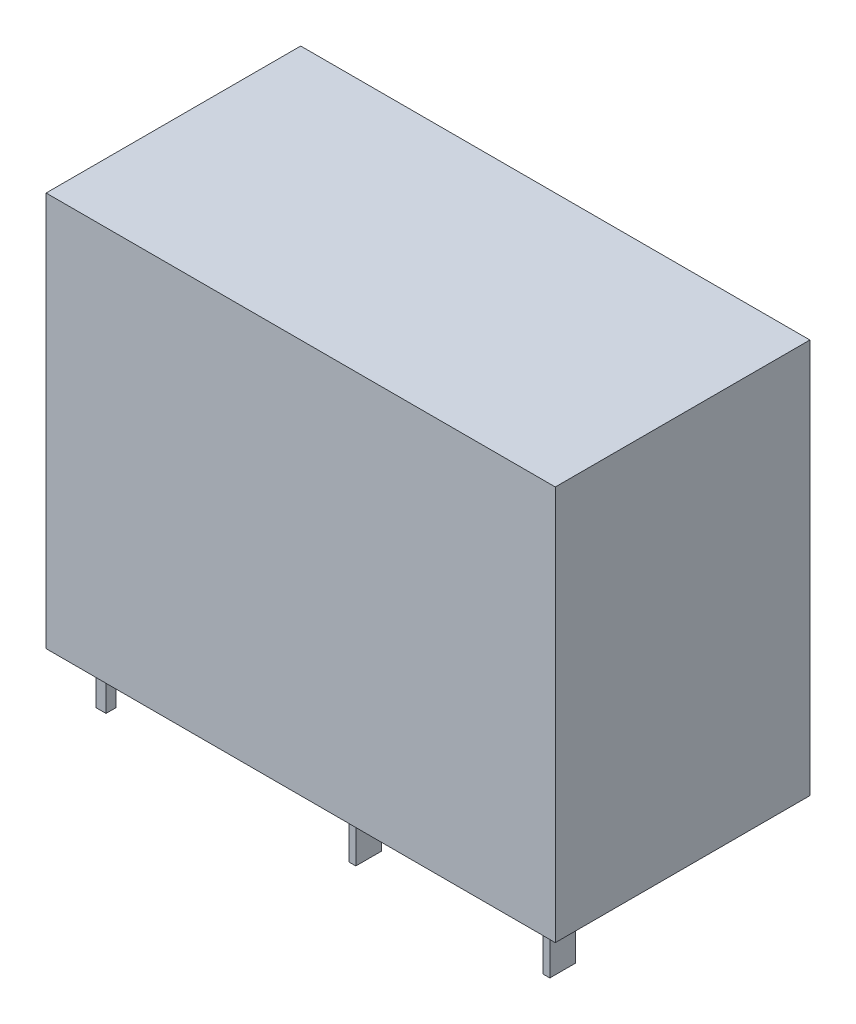
ISO-10303-21;
HEADER;
FILE_DESCRIPTION(('STEP AP214'),'2;1');
FILE_NAME('part.step','',(''),(''),'','','');
FILE_SCHEMA(('AUTOMOTIVE_DESIGN { 1 0 10303 214 1 1 1 1 }'));
ENDSEC;
DATA;
#1=APPLICATION_CONTEXT('core data for automotive mechanical design processes');
#2=APPLICATION_PROTOCOL_DEFINITION('international standard','automotive_design',2000,#1);
#3=PRODUCT_CONTEXT('',#1,'mechanical');
#4=PRODUCT('Part','Part','',(#3));
#5=PRODUCT_RELATED_PRODUCT_CATEGORY('part','',(#4));
#6=PRODUCT_DEFINITION_FORMATION('','',#4);
#7=PRODUCT_DEFINITION_CONTEXT('part definition',#1,'design');
#8=PRODUCT_DEFINITION('design','',#6,#7);
#9=PRODUCT_DEFINITION_SHAPE('','',#8);
#10=(LENGTH_UNIT() NAMED_UNIT(*) SI_UNIT(.MILLI.,.METRE.));
#11=(NAMED_UNIT(*) PLANE_ANGLE_UNIT() SI_UNIT($,.RADIAN.));
#12=(NAMED_UNIT(*) SI_UNIT($,.STERADIAN.) SOLID_ANGLE_UNIT());
#13=UNCERTAINTY_MEASURE_WITH_UNIT(LENGTH_MEASURE(1.E-05),#10,'distance_accuracy_value','');
#14=(GEOMETRIC_REPRESENTATION_CONTEXT(3) GLOBAL_UNCERTAINTY_ASSIGNED_CONTEXT((#13)) GLOBAL_UNIT_ASSIGNED_CONTEXT((#10,
#11,#12)) REPRESENTATION_CONTEXT('',''));
#15=CARTESIAN_POINT('',(0.,0.,0.));
#16=DIRECTION('',(0.,0.,1.));
#17=DIRECTION('',(1.,0.,0.));
#18=AXIS2_PLACEMENT_3D('',#15,#16,#17);
#19=CARTESIAN_POINT('',(6.55500000000001,-2.,-3.31));
#20=DIRECTION('',(1.,0.,0.));
#21=DIRECTION('',(0.,0.,-1.));
#22=AXIS2_PLACEMENT_3D('',#19,#20,#21);
#23=PLANE('',#22);
#24=DIRECTION('',(0.,0.,-1.));
#25=VECTOR('',#24,1.);
#26=CARTESIAN_POINT('',(6.55500000000001,0.,-3.31));
#27=LINE('',#26,#25);
#28=CARTESIAN_POINT('',(6.55500000000001,0.,-3.31));
#29=VERTEX_POINT('',#28);
#30=CARTESIAN_POINT('',(6.55500000000001,0.,-4.31));
#31=VERTEX_POINT('',#30);
#32=EDGE_CURVE('E127',#29,#31,#27,.T.);
#33=ORIENTED_EDGE('',*,*,#32,.F.);
#34=DIRECTION('',(0.,1.,0.));
#35=VECTOR('',#34,1.);
#36=CARTESIAN_POINT('',(6.55500000000001,-2.,-3.31));
#37=LINE('',#36,#35);
#38=CARTESIAN_POINT('',(6.55500000000001,-2.,-3.31));
#39=VERTEX_POINT('',#38);
#40=EDGE_CURVE('E12',#39,#29,#37,.T.);
#41=ORIENTED_EDGE('',*,*,#40,.F.);
#42=DIRECTION('',(0.,0.,-1.));
#43=VECTOR('',#42,1.);
#44=CARTESIAN_POINT('',(6.55500000000001,-2.,-3.31));
#45=LINE('',#44,#43);
#46=CARTESIAN_POINT('',(6.55500000000001,-2.,-4.31));
#47=VERTEX_POINT('',#46);
#48=EDGE_CURVE('E117',#39,#47,#45,.T.);
#49=ORIENTED_EDGE('',*,*,#48,.T.);
#50=DIRECTION('',(0.,1.,0.));
#51=VECTOR('',#50,1.);
#52=CARTESIAN_POINT('',(6.55500000000001,-2.,-4.31));
#53=LINE('',#52,#51);
#54=EDGE_CURVE('E58',#47,#31,#53,.T.);
#55=ORIENTED_EDGE('',*,*,#54,.T.);
#56=EDGE_LOOP('',(#33,#41,#49,#55));
#57=FACE_BOUND('',#56,.T.);
#58=ADVANCED_FACE('F55',(#57),#23,.T.);
#59=CARTESIAN_POINT('',(6.28500000000001,-2.,-3.31));
#60=DIRECTION('',(0.,0.,1.));
#61=DIRECTION('',(1.,0.,0.));
#62=AXIS2_PLACEMENT_3D('',#59,#60,#61);
#63=PLANE('',#62);
#64=DIRECTION('',(1.,0.,0.));
#65=VECTOR('',#64,1.);
#66=CARTESIAN_POINT('',(6.28500000000001,0.,-3.31));
#67=LINE('',#66,#65);
#68=CARTESIAN_POINT('',(6.28500000000001,0.,-3.31));
#69=VERTEX_POINT('',#68);
#70=EDGE_CURVE('E122',#69,#29,#67,.T.);
#71=ORIENTED_EDGE('',*,*,#70,.F.);
#72=DIRECTION('',(0.,1.,0.));
#73=VECTOR('',#72,1.);
#74=CARTESIAN_POINT('',(6.28500000000001,-2.,-3.31));
#75=LINE('',#74,#73);
#76=CARTESIAN_POINT('',(6.28500000000001,-2.,-3.31));
#77=VERTEX_POINT('',#76);
#78=EDGE_CURVE('E65',#77,#69,#75,.T.);
#79=ORIENTED_EDGE('',*,*,#78,.F.);
#80=DIRECTION('',(1.,0.,0.));
#81=VECTOR('',#80,1.);
#82=CARTESIAN_POINT('',(6.28500000000001,-2.,-3.31));
#83=LINE('',#82,#81);
#84=EDGE_CURVE('E112',#77,#39,#83,.T.);
#85=ORIENTED_EDGE('',*,*,#84,.T.);
#86=ORIENTED_EDGE('',*,*,#40,.T.);
#87=EDGE_LOOP('',(#71,#79,#85,#86));
#88=FACE_BOUND('',#87,.T.);
#89=ADVANCED_FACE('F141',(#88),#63,.T.);
#90=CARTESIAN_POINT('',(6.28500000000001,-2.,-3.31));
#91=DIRECTION('',(-1.,0.,0.));
#92=DIRECTION('',(0.,0.,1.));
#93=AXIS2_PLACEMENT_3D('',#90,#91,#92);
#94=PLANE('',#93);
#95=DIRECTION('',(0.,0.,1.));
#96=VECTOR('',#95,1.);
#97=CARTESIAN_POINT('',(6.28500000000001,0.,-3.31));
#98=LINE('',#97,#96);
#99=CARTESIAN_POINT('',(6.28500000000001,0.,-4.31));
#100=VERTEX_POINT('',#99);
#101=EDGE_CURVE('E106',#100,#69,#98,.T.);
#102=ORIENTED_EDGE('',*,*,#101,.F.);
#103=DIRECTION('',(0.,1.,0.));
#104=VECTOR('',#103,1.);
#105=CARTESIAN_POINT('',(6.28500000000001,-2.,-4.31));
#106=LINE('',#105,#104);
#107=CARTESIAN_POINT('',(6.28500000000001,-2.,-4.31));
#108=VERTEX_POINT('',#107);
#109=EDGE_CURVE('E101',#108,#100,#106,.T.);
#110=ORIENTED_EDGE('',*,*,#109,.F.);
#111=DIRECTION('',(0.,0.,1.));
#112=VECTOR('',#111,1.);
#113=CARTESIAN_POINT('',(6.28500000000001,-2.,-3.31));
#114=LINE('',#113,#112);
#115=EDGE_CURVE('E104',#108,#77,#114,.T.);
#116=ORIENTED_EDGE('',*,*,#115,.T.);
#117=ORIENTED_EDGE('',*,*,#78,.T.);
#118=EDGE_LOOP('',(#102,#110,#116,#117));
#119=FACE_BOUND('',#118,.T.);
#120=ADVANCED_FACE('F103',(#119),#94,.T.);
#121=CARTESIAN_POINT('',(6.28500000000001,-2.,-4.31));
#122=DIRECTION('',(0.,0.,-1.));
#123=DIRECTION('',(-1.,0.,0.));
#124=AXIS2_PLACEMENT_3D('',#121,#122,#123);
#125=PLANE('',#124);
#126=DIRECTION('',(-1.,0.,0.));
#127=VECTOR('',#126,1.);
#128=CARTESIAN_POINT('',(6.28500000000001,0.,-4.31));
#129=LINE('',#128,#127);
#130=EDGE_CURVE('E130',#31,#100,#129,.T.);
#131=ORIENTED_EDGE('',*,*,#130,.F.);
#132=ORIENTED_EDGE('',*,*,#54,.F.);
#133=DIRECTION('',(-1.,0.,0.));
#134=VECTOR('',#133,1.);
#135=CARTESIAN_POINT('',(6.28500000000001,-2.,-4.31));
#136=LINE('',#135,#134);
#137=EDGE_CURVE('E111',#47,#108,#136,.T.);
#138=ORIENTED_EDGE('',*,*,#137,.T.);
#139=ORIENTED_EDGE('',*,*,#109,.T.);
#140=EDGE_LOOP('',(#131,#132,#138,#139));
#141=FACE_BOUND('',#140,.T.);
#142=ADVANCED_FACE('F115',(#141),#125,.T.);
#143=CARTESIAN_POINT('',(0.,-2.,0.));
#144=DIRECTION('',(0.,-1.,0.));
#145=DIRECTION('',(0.,0.,-1.));
#146=AXIS2_PLACEMENT_3D('',#143,#144,#145);
#147=PLANE('',#146);
#148=ORIENTED_EDGE('',*,*,#48,.F.);
#149=ORIENTED_EDGE('',*,*,#84,.F.);
#150=ORIENTED_EDGE('',*,*,#115,.F.);
#151=ORIENTED_EDGE('',*,*,#137,.F.);
#152=EDGE_LOOP('',(#148,#149,#150,#151));
#153=FACE_BOUND('',#152,.T.);
#154=ADVANCED_FACE('F110',(#153),#147,.T.);
#155=CARTESIAN_POINT('',(0.,0.,0.));
#156=DIRECTION('',(0.,-1.,0.));
#157=DIRECTION('',(0.,0.,-1.));
#158=AXIS2_PLACEMENT_3D('',#155,#156,#157);
#159=PLANE('',#158);
#160=ORIENTED_EDGE('',*,*,#32,.T.);
#161=ORIENTED_EDGE('',*,*,#130,.T.);
#162=ORIENTED_EDGE('',*,*,#101,.T.);
#163=ORIENTED_EDGE('',*,*,#70,.T.);
#164=EDGE_LOOP('',(#160,#161,#162,#163));
#165=FACE_BOUND('',#164,.T.);
#166=ADVANCED_FACE('F140',(#165),#159,.F.);
#167=CLOSED_SHELL('',(#58,#89,#120,#142,#154,#166));
#168=MANIFOLD_SOLID_BREP('B2',#167);
#169=CARTESIAN_POINT('',(8.82500000000001,-2.,4.31));
#170=DIRECTION('',(-1.,0.,0.));
#171=DIRECTION('',(0.,0.,1.));
#172=AXIS2_PLACEMENT_3D('',#169,#170,#171);
#173=PLANE('',#172);
#174=DIRECTION('',(0.,0.,1.));
#175=VECTOR('',#174,1.);
#176=CARTESIAN_POINT('',(8.82500000000001,0.,4.31));
#177=LINE('',#176,#175);
#178=CARTESIAN_POINT('',(8.82500000000001,0.,3.31));
#179=VERTEX_POINT('',#178);
#180=CARTESIAN_POINT('',(8.82500000000001,0.,4.31));
#181=VERTEX_POINT('',#180);
#182=EDGE_CURVE('E278',#179,#181,#177,.T.);
#183=ORIENTED_EDGE('',*,*,#182,.F.);
#184=DIRECTION('',(0.,1.,0.));
#185=VECTOR('',#184,1.);
#186=CARTESIAN_POINT('',(8.82500000000001,-2.,3.31));
#187=LINE('',#186,#185);
#188=CARTESIAN_POINT('',(8.82500000000001,-2.,3.31));
#189=VERTEX_POINT('',#188);
#190=EDGE_CURVE('E53',#189,#179,#187,.T.);
#191=ORIENTED_EDGE('',*,*,#190,.F.);
#192=DIRECTION('',(0.,0.,1.));
#193=VECTOR('',#192,1.);
#194=CARTESIAN_POINT('',(8.82500000000001,-2.,4.31));
#195=LINE('',#194,#193);
#196=CARTESIAN_POINT('',(8.82500000000001,-2.,4.31));
#197=VERTEX_POINT('',#196);
#198=EDGE_CURVE('E268',#189,#197,#195,.T.);
#199=ORIENTED_EDGE('',*,*,#198,.T.);
#200=DIRECTION('',(0.,1.,0.));
#201=VECTOR('',#200,1.);
#202=CARTESIAN_POINT('',(8.82500000000001,-2.,4.31));
#203=LINE('',#202,#201);
#204=EDGE_CURVE('E209',#197,#181,#203,.T.);
#205=ORIENTED_EDGE('',*,*,#204,.T.);
#206=EDGE_LOOP('',(#183,#191,#199,#205));
#207=FACE_BOUND('',#206,.T.);
#208=ADVANCED_FACE('F206',(#207),#173,.T.);
#209=CARTESIAN_POINT('',(9.09500000000001,-2.,3.31));
#210=DIRECTION('',(0.,0.,-1.));
#211=DIRECTION('',(-1.,0.,0.));
#212=AXIS2_PLACEMENT_3D('',#209,#210,#211);
#213=PLANE('',#212);
#214=DIRECTION('',(-1.,0.,0.));
#215=VECTOR('',#214,1.);
#216=CARTESIAN_POINT('',(9.09500000000001,0.,3.31));
#217=LINE('',#216,#215);
#218=CARTESIAN_POINT('',(9.09500000000001,0.,3.31));
#219=VERTEX_POINT('',#218);
#220=EDGE_CURVE('E273',#219,#179,#217,.T.);
#221=ORIENTED_EDGE('',*,*,#220,.F.);
#222=DIRECTION('',(0.,1.,0.));
#223=VECTOR('',#222,1.);
#224=CARTESIAN_POINT('',(9.09500000000001,-2.,3.31));
#225=LINE('',#224,#223);
#226=CARTESIAN_POINT('',(9.09500000000001,-2.,3.31));
#227=VERTEX_POINT('',#226);
#228=EDGE_CURVE('E216',#227,#219,#225,.T.);
#229=ORIENTED_EDGE('',*,*,#228,.F.);
#230=DIRECTION('',(-1.,0.,0.));
#231=VECTOR('',#230,1.);
#232=CARTESIAN_POINT('',(9.09500000000001,-2.,3.31));
#233=LINE('',#232,#231);
#234=EDGE_CURVE('E263',#227,#189,#233,.T.);
#235=ORIENTED_EDGE('',*,*,#234,.T.);
#236=ORIENTED_EDGE('',*,*,#190,.T.);
#237=EDGE_LOOP('',(#221,#229,#235,#236));
#238=FACE_BOUND('',#237,.T.);
#239=ADVANCED_FACE('F292',(#238),#213,.T.);
#240=CARTESIAN_POINT('',(9.09500000000001,-2.,4.31));
#241=DIRECTION('',(1.,0.,0.));
#242=DIRECTION('',(0.,0.,-1.));
#243=AXIS2_PLACEMENT_3D('',#240,#241,#242);
#244=PLANE('',#243);
#245=DIRECTION('',(0.,0.,-1.));
#246=VECTOR('',#245,1.);
#247=CARTESIAN_POINT('',(9.09500000000001,0.,4.31));
#248=LINE('',#247,#246);
#249=CARTESIAN_POINT('',(9.09500000000001,0.,4.31));
#250=VERTEX_POINT('',#249);
#251=EDGE_CURVE('E257',#250,#219,#248,.T.);
#252=ORIENTED_EDGE('',*,*,#251,.F.);
#253=DIRECTION('',(0.,1.,0.));
#254=VECTOR('',#253,1.);
#255=CARTESIAN_POINT('',(9.09500000000001,-2.,4.31));
#256=LINE('',#255,#254);
#257=CARTESIAN_POINT('',(9.09500000000001,-2.,4.31));
#258=VERTEX_POINT('',#257);
#259=EDGE_CURVE('E252',#258,#250,#256,.T.);
#260=ORIENTED_EDGE('',*,*,#259,.F.);
#261=DIRECTION('',(0.,0.,-1.));
#262=VECTOR('',#261,1.);
#263=CARTESIAN_POINT('',(9.09500000000001,-2.,4.31));
#264=LINE('',#263,#262);
#265=EDGE_CURVE('E255',#258,#227,#264,.T.);
#266=ORIENTED_EDGE('',*,*,#265,.T.);
#267=ORIENTED_EDGE('',*,*,#228,.T.);
#268=EDGE_LOOP('',(#252,#260,#266,#267));
#269=FACE_BOUND('',#268,.T.);
#270=ADVANCED_FACE('F254',(#269),#244,.T.);
#271=CARTESIAN_POINT('',(9.09500000000001,-2.,4.31));
#272=DIRECTION('',(0.,0.,1.));
#273=DIRECTION('',(1.,0.,0.));
#274=AXIS2_PLACEMENT_3D('',#271,#272,#273);
#275=PLANE('',#274);
#276=DIRECTION('',(1.,0.,0.));
#277=VECTOR('',#276,1.);
#278=CARTESIAN_POINT('',(9.09500000000001,0.,4.31));
#279=LINE('',#278,#277);
#280=EDGE_CURVE('E282',#181,#250,#279,.T.);
#281=ORIENTED_EDGE('',*,*,#280,.F.);
#282=ORIENTED_EDGE('',*,*,#204,.F.);
#283=DIRECTION('',(1.,0.,0.));
#284=VECTOR('',#283,1.);
#285=CARTESIAN_POINT('',(9.09500000000001,-2.,4.31));
#286=LINE('',#285,#284);
#287=EDGE_CURVE('E262',#197,#258,#286,.T.);
#288=ORIENTED_EDGE('',*,*,#287,.T.);
#289=ORIENTED_EDGE('',*,*,#259,.T.);
#290=EDGE_LOOP('',(#281,#282,#288,#289));
#291=FACE_BOUND('',#290,.T.);
#292=ADVANCED_FACE('F266',(#291),#275,.T.);
#293=CARTESIAN_POINT('',(0.,-2.,0.));
#294=DIRECTION('',(0.,1.,0.));
#295=DIRECTION('',(0.,0.,1.));
#296=AXIS2_PLACEMENT_3D('',#293,#294,#295);
#297=PLANE('',#296);
#298=ORIENTED_EDGE('',*,*,#198,.F.);
#299=ORIENTED_EDGE('',*,*,#234,.F.);
#300=ORIENTED_EDGE('',*,*,#265,.F.);
#301=ORIENTED_EDGE('',*,*,#287,.F.);
#302=EDGE_LOOP('',(#298,#299,#300,#301));
#303=FACE_BOUND('',#302,.T.);
#304=ADVANCED_FACE('F261',(#303),#297,.F.);
#305=CARTESIAN_POINT('',(0.,0.,0.));
#306=DIRECTION('',(0.,1.,0.));
#307=DIRECTION('',(0.,0.,1.));
#308=AXIS2_PLACEMENT_3D('',#305,#306,#307);
#309=PLANE('',#308);
#310=ORIENTED_EDGE('',*,*,#182,.T.);
#311=ORIENTED_EDGE('',*,*,#280,.T.);
#312=ORIENTED_EDGE('',*,*,#251,.T.);
#313=ORIENTED_EDGE('',*,*,#220,.T.);
#314=EDGE_LOOP('',(#310,#311,#312,#313));
#315=FACE_BOUND('',#314,.T.);
#316=ADVANCED_FACE('F291',(#315),#309,.T.);
#317=CLOSED_SHELL('',(#208,#239,#270,#292,#304,#316));
#318=MANIFOLD_SOLID_BREP('B6',#317);
#319=CARTESIAN_POINT('',(1.47500000000001,-2.,4.31));
#320=DIRECTION('',(1.,0.,0.));
#321=DIRECTION('',(0.,0.,-1.));
#322=AXIS2_PLACEMENT_3D('',#319,#320,#321);
#323=PLANE('',#322);
#324=DIRECTION('',(0.,0.,-1.));
#325=VECTOR('',#324,1.);
#326=CARTESIAN_POINT('',(1.47500000000001,0.,4.31));
#327=LINE('',#326,#325);
#328=CARTESIAN_POINT('',(1.47500000000001,0.,4.31));
#329=VERTEX_POINT('',#328);
#330=CARTESIAN_POINT('',(1.47500000000001,0.,3.31));
#331=VERTEX_POINT('',#330);
#332=EDGE_CURVE('E427',#329,#331,#327,.T.);
#333=ORIENTED_EDGE('',*,*,#332,.F.);
#334=DIRECTION('',(0.,1.,0.));
#335=VECTOR('',#334,1.);
#336=CARTESIAN_POINT('',(1.47500000000001,-2.,4.31));
#337=LINE('',#336,#335);
#338=CARTESIAN_POINT('',(1.47500000000001,-2.,4.31));
#339=VERTEX_POINT('',#338);
#340=EDGE_CURVE('E204',#339,#329,#337,.T.);
#341=ORIENTED_EDGE('',*,*,#340,.F.);
#342=DIRECTION('',(0.,0.,-1.));
#343=VECTOR('',#342,1.);
#344=CARTESIAN_POINT('',(1.47500000000001,-2.,4.31));
#345=LINE('',#344,#343);
#346=CARTESIAN_POINT('',(1.47500000000001,-2.,3.31));
#347=VERTEX_POINT('',#346);
#348=EDGE_CURVE('E419',#339,#347,#345,.T.);
#349=ORIENTED_EDGE('',*,*,#348,.T.);
#350=DIRECTION('',(0.,1.,0.));
#351=VECTOR('',#350,1.);
#352=CARTESIAN_POINT('',(1.47500000000001,-2.,3.31));
#353=LINE('',#352,#351);
#354=EDGE_CURVE('E360',#347,#331,#353,.T.);
#355=ORIENTED_EDGE('',*,*,#354,.T.);
#356=EDGE_LOOP('',(#333,#341,#349,#355));
#357=FACE_BOUND('',#356,.T.);
#358=ADVANCED_FACE('F357',(#357),#323,.T.);
#359=CARTESIAN_POINT('',(1.20500000000001,-2.,4.31));
#360=DIRECTION('',(0.,0.,1.));
#361=DIRECTION('',(1.,0.,0.));
#362=AXIS2_PLACEMENT_3D('',#359,#360,#361);
#363=PLANE('',#362);
#364=DIRECTION('',(1.,0.,0.));
#365=VECTOR('',#364,1.);
#366=CARTESIAN_POINT('',(1.20500000000001,0.,4.31));
#367=LINE('',#366,#365);
#368=CARTESIAN_POINT('',(1.20500000000001,0.,4.31));
#369=VERTEX_POINT('',#368);
#370=EDGE_CURVE('E423',#369,#329,#367,.T.);
#371=ORIENTED_EDGE('',*,*,#370,.F.);
#372=DIRECTION('',(0.,1.,0.));
#373=VECTOR('',#372,1.);
#374=CARTESIAN_POINT('',(1.20500000000001,-2.,4.31));
#375=LINE('',#374,#373);
#376=CARTESIAN_POINT('',(1.20500000000001,-2.,4.31));
#377=VERTEX_POINT('',#376);
#378=EDGE_CURVE('E367',#377,#369,#375,.T.);
#379=ORIENTED_EDGE('',*,*,#378,.F.);
#380=DIRECTION('',(1.,0.,0.));
#381=VECTOR('',#380,1.);
#382=CARTESIAN_POINT('',(1.20500000000001,-2.,4.31));
#383=LINE('',#382,#381);
#384=EDGE_CURVE('E414',#377,#339,#383,.T.);
#385=ORIENTED_EDGE('',*,*,#384,.T.);
#386=ORIENTED_EDGE('',*,*,#340,.T.);
#387=EDGE_LOOP('',(#371,#379,#385,#386));
#388=FACE_BOUND('',#387,.T.);
#389=ADVANCED_FACE('F443',(#388),#363,.T.);
#390=CARTESIAN_POINT('',(1.20500000000001,-2.,4.31));
#391=DIRECTION('',(-1.,0.,0.));
#392=DIRECTION('',(0.,0.,1.));
#393=AXIS2_PLACEMENT_3D('',#390,#391,#392);
#394=PLANE('',#393);
#395=DIRECTION('',(0.,0.,1.));
#396=VECTOR('',#395,1.);
#397=CARTESIAN_POINT('',(1.20500000000001,0.,4.31));
#398=LINE('',#397,#396);
#399=CARTESIAN_POINT('',(1.20500000000001,0.,3.31));
#400=VERTEX_POINT('',#399);
#401=EDGE_CURVE('E408',#400,#369,#398,.T.);
#402=ORIENTED_EDGE('',*,*,#401,.F.);
#403=DIRECTION('',(0.,1.,0.));
#404=VECTOR('',#403,1.);
#405=CARTESIAN_POINT('',(1.20500000000001,-2.,3.31));
#406=LINE('',#405,#404);
#407=CARTESIAN_POINT('',(1.20500000000001,-2.,3.31));
#408=VERTEX_POINT('',#407);
#409=EDGE_CURVE('E403',#408,#400,#406,.T.);
#410=ORIENTED_EDGE('',*,*,#409,.F.);
#411=DIRECTION('',(0.,0.,1.));
#412=VECTOR('',#411,1.);
#413=CARTESIAN_POINT('',(1.20500000000001,-2.,4.31));
#414=LINE('',#413,#412);
#415=EDGE_CURVE('E406',#408,#377,#414,.T.);
#416=ORIENTED_EDGE('',*,*,#415,.T.);
#417=ORIENTED_EDGE('',*,*,#378,.T.);
#418=EDGE_LOOP('',(#402,#410,#416,#417));
#419=FACE_BOUND('',#418,.T.);
#420=ADVANCED_FACE('F405',(#419),#394,.T.);
#421=CARTESIAN_POINT('',(1.20500000000001,-2.,3.31));
#422=DIRECTION('',(0.,0.,-1.));
#423=DIRECTION('',(-1.,0.,0.));
#424=AXIS2_PLACEMENT_3D('',#421,#422,#423);
#425=PLANE('',#424);
#426=DIRECTION('',(-1.,0.,0.));
#427=VECTOR('',#426,1.);
#428=CARTESIAN_POINT('',(1.20500000000001,0.,3.31));
#429=LINE('',#428,#427);
#430=EDGE_CURVE('E431',#331,#400,#429,.T.);
#431=ORIENTED_EDGE('',*,*,#430,.F.);
#432=ORIENTED_EDGE('',*,*,#354,.F.);
#433=DIRECTION('',(-1.,0.,0.));
#434=VECTOR('',#433,1.);
#435=CARTESIAN_POINT('',(1.20500000000001,-2.,3.31));
#436=LINE('',#435,#434);
#437=EDGE_CURVE('E413',#347,#408,#436,.T.);
#438=ORIENTED_EDGE('',*,*,#437,.T.);
#439=ORIENTED_EDGE('',*,*,#409,.T.);
#440=EDGE_LOOP('',(#431,#432,#438,#439));
#441=FACE_BOUND('',#440,.T.);
#442=ADVANCED_FACE('F417',(#441),#425,.T.);
#443=CARTESIAN_POINT('',(0.,-2.,0.));
#444=DIRECTION('',(0.,-1.,0.));
#445=DIRECTION('',(0.,0.,-1.));
#446=AXIS2_PLACEMENT_3D('',#443,#444,#445);
#447=PLANE('',#446);
#448=ORIENTED_EDGE('',*,*,#348,.F.);
#449=ORIENTED_EDGE('',*,*,#384,.F.);
#450=ORIENTED_EDGE('',*,*,#415,.F.);
#451=ORIENTED_EDGE('',*,*,#437,.F.);
#452=EDGE_LOOP('',(#448,#449,#450,#451));
#453=FACE_BOUND('',#452,.T.);
#454=ADVANCED_FACE('F412',(#453),#447,.T.);
#455=CARTESIAN_POINT('',(0.,0.,0.));
#456=DIRECTION('',(0.,-1.,0.));
#457=DIRECTION('',(0.,0.,-1.));
#458=AXIS2_PLACEMENT_3D('',#455,#456,#457);
#459=PLANE('',#458);
#460=ORIENTED_EDGE('',*,*,#332,.T.);
#461=ORIENTED_EDGE('',*,*,#430,.T.);
#462=ORIENTED_EDGE('',*,*,#401,.T.);
#463=ORIENTED_EDGE('',*,*,#370,.T.);
#464=EDGE_LOOP('',(#460,#461,#462,#463));
#465=FACE_BOUND('',#464,.T.);
#466=ADVANCED_FACE('F442',(#465),#459,.F.);
#467=CLOSED_SHELL('',(#358,#389,#420,#442,#454,#466));
#468=MANIFOLD_SOLID_BREP('B47',#467);
#469=CARTESIAN_POINT('',(-8.62,-2.,4.0281341208517));
#470=DIRECTION('',(1.,0.,0.));
#471=DIRECTION('',(0.,0.,-1.));
#472=AXIS2_PLACEMENT_3D('',#469,#470,#471);
#473=PLANE('',#472);
#474=DIRECTION('',(0.,0.,-1.));
#475=VECTOR('',#474,1.);
#476=CARTESIAN_POINT('',(-8.62,0.,4.0281341208517));
#477=LINE('',#476,#475);
#478=CARTESIAN_POINT('',(-8.62,0.,4.0281341208517));
#479=VERTEX_POINT('',#478);
#480=CARTESIAN_POINT('',(-8.62,0.,3.6281341208517));
#481=VERTEX_POINT('',#480);
#482=EDGE_CURVE('E580',#479,#481,#477,.T.);
#483=ORIENTED_EDGE('',*,*,#482,.F.);
#484=DIRECTION('',(0.,1.,0.));
#485=VECTOR('',#484,1.);
#486=CARTESIAN_POINT('',(-8.62,-2.,4.0281341208517));
#487=LINE('',#486,#485);
#488=CARTESIAN_POINT('',(-8.62,-2.,4.0281341208517));
#489=VERTEX_POINT('',#488);
#490=EDGE_CURVE('E355',#489,#479,#487,.T.);
#491=ORIENTED_EDGE('',*,*,#490,.F.);
#492=DIRECTION('',(0.,0.,-1.));
#493=VECTOR('',#492,1.);
#494=CARTESIAN_POINT('',(-8.62,-2.,4.0281341208517));
#495=LINE('',#494,#493);
#496=CARTESIAN_POINT('',(-8.62,-2.,3.6281341208517));
#497=VERTEX_POINT('',#496);
#498=EDGE_CURVE('E570',#489,#497,#495,.T.);
#499=ORIENTED_EDGE('',*,*,#498,.T.);
#500=DIRECTION('',(0.,1.,0.));
#501=VECTOR('',#500,1.);
#502=CARTESIAN_POINT('',(-8.62,-2.,3.6281341208517));
#503=LINE('',#502,#501);
#504=EDGE_CURVE('E511',#497,#481,#503,.T.);
#505=ORIENTED_EDGE('',*,*,#504,.T.);
#506=EDGE_LOOP('',(#483,#491,#499,#505));
#507=FACE_BOUND('',#506,.T.);
#508=ADVANCED_FACE('F508',(#507),#473,.T.);
#509=CARTESIAN_POINT('',(-9.01999999999999,-2.,4.0281341208517));
#510=DIRECTION('',(0.,0.,1.));
#511=DIRECTION('',(1.,0.,0.));
#512=AXIS2_PLACEMENT_3D('',#509,#510,#511);
#513=PLANE('',#512);
#514=DIRECTION('',(1.,0.,0.));
#515=VECTOR('',#514,1.);
#516=CARTESIAN_POINT('',(-9.01999999999999,0.,4.0281341208517));
#517=LINE('',#516,#515);
#518=CARTESIAN_POINT('',(-9.01999999999999,0.,4.0281341208517));
#519=VERTEX_POINT('',#518);
#520=EDGE_CURVE('E575',#519,#479,#517,.T.);
#521=ORIENTED_EDGE('',*,*,#520,.F.);
#522=DIRECTION('',(0.,1.,0.));
#523=VECTOR('',#522,1.);
#524=CARTESIAN_POINT('',(-9.01999999999999,-2.,4.0281341208517));
#525=LINE('',#524,#523);
#526=CARTESIAN_POINT('',(-9.01999999999999,-2.,4.0281341208517));
#527=VERTEX_POINT('',#526);
#528=EDGE_CURVE('E518',#527,#519,#525,.T.);
#529=ORIENTED_EDGE('',*,*,#528,.F.);
#530=DIRECTION('',(1.,0.,0.));
#531=VECTOR('',#530,1.);
#532=CARTESIAN_POINT('',(-9.01999999999999,-2.,4.0281341208517));
#533=LINE('',#532,#531);
#534=EDGE_CURVE('E565',#527,#489,#533,.T.);
#535=ORIENTED_EDGE('',*,*,#534,.T.);
#536=ORIENTED_EDGE('',*,*,#490,.T.);
#537=EDGE_LOOP('',(#521,#529,#535,#536));
#538=FACE_BOUND('',#537,.T.);
#539=ADVANCED_FACE('F594',(#538),#513,.T.);
#540=CARTESIAN_POINT('',(-9.01999999999999,-2.,4.0281341208517));
#541=DIRECTION('',(-1.,0.,0.));
#542=DIRECTION('',(0.,0.,1.));
#543=AXIS2_PLACEMENT_3D('',#540,#541,#542);
#544=PLANE('',#543);
#545=DIRECTION('',(0.,0.,1.));
#546=VECTOR('',#545,1.);
#547=CARTESIAN_POINT('',(-9.01999999999999,0.,4.0281341208517));
#548=LINE('',#547,#546);
#549=CARTESIAN_POINT('',(-9.01999999999999,0.,3.6281341208517));
#550=VERTEX_POINT('',#549);
#551=EDGE_CURVE('E559',#550,#519,#548,.T.);
#552=ORIENTED_EDGE('',*,*,#551,.F.);
#553=DIRECTION('',(0.,1.,0.));
#554=VECTOR('',#553,1.);
#555=CARTESIAN_POINT('',(-9.01999999999999,-2.,3.6281341208517));
#556=LINE('',#555,#554);
#557=CARTESIAN_POINT('',(-9.01999999999999,-2.,3.6281341208517));
#558=VERTEX_POINT('',#557);
#559=EDGE_CURVE('E554',#558,#550,#556,.T.);
#560=ORIENTED_EDGE('',*,*,#559,.F.);
#561=DIRECTION('',(0.,0.,1.));
#562=VECTOR('',#561,1.);
#563=CARTESIAN_POINT('',(-9.01999999999999,-2.,4.0281341208517));
#564=LINE('',#563,#562);
#565=EDGE_CURVE('E557',#558,#527,#564,.T.);
#566=ORIENTED_EDGE('',*,*,#565,.T.);
#567=ORIENTED_EDGE('',*,*,#528,.T.);
#568=EDGE_LOOP('',(#552,#560,#566,#567));
#569=FACE_BOUND('',#568,.T.);
#570=ADVANCED_FACE('F556',(#569),#544,.T.);
#571=CARTESIAN_POINT('',(-9.01999999999999,-2.,3.6281341208517));
#572=DIRECTION('',(0.,0.,-1.));
#573=DIRECTION('',(-1.,0.,0.));
#574=AXIS2_PLACEMENT_3D('',#571,#572,#573);
#575=PLANE('',#574);
#576=DIRECTION('',(-1.,0.,0.));
#577=VECTOR('',#576,1.);
#578=CARTESIAN_POINT('',(-9.01999999999999,0.,3.6281341208517));
#579=LINE('',#578,#577);
#580=EDGE_CURVE('E583',#481,#550,#579,.T.);
#581=ORIENTED_EDGE('',*,*,#580,.F.);
#582=ORIENTED_EDGE('',*,*,#504,.F.);
#583=DIRECTION('',(-1.,0.,0.));
#584=VECTOR('',#583,1.);
#585=CARTESIAN_POINT('',(-9.01999999999999,-2.,3.6281341208517));
#586=LINE('',#585,#584);
#587=EDGE_CURVE('E564',#497,#558,#586,.T.);
#588=ORIENTED_EDGE('',*,*,#587,.T.);
#589=ORIENTED_EDGE('',*,*,#559,.T.);
#590=EDGE_LOOP('',(#581,#582,#588,#589));
#591=FACE_BOUND('',#590,.T.);
#592=ADVANCED_FACE('F568',(#591),#575,.T.);
#593=CARTESIAN_POINT('',(0.,-2.,0.));
#594=DIRECTION('',(0.,-1.,0.));
#595=DIRECTION('',(0.,0.,-1.));
#596=AXIS2_PLACEMENT_3D('',#593,#594,#595);
#597=PLANE('',#596);
#598=ORIENTED_EDGE('',*,*,#498,.F.);
#599=ORIENTED_EDGE('',*,*,#534,.F.);
#600=ORIENTED_EDGE('',*,*,#565,.F.);
#601=ORIENTED_EDGE('',*,*,#587,.F.);
#602=EDGE_LOOP('',(#598,#599,#600,#601));
#603=FACE_BOUND('',#602,.T.);
#604=ADVANCED_FACE('F563',(#603),#597,.T.);
#605=CARTESIAN_POINT('',(0.,0.,0.));
#606=DIRECTION('',(0.,-1.,0.));
#607=DIRECTION('',(0.,0.,-1.));
#608=AXIS2_PLACEMENT_3D('',#605,#606,#607);
#609=PLANE('',#608);
#610=ORIENTED_EDGE('',*,*,#482,.T.);
#611=ORIENTED_EDGE('',*,*,#580,.T.);
#612=ORIENTED_EDGE('',*,*,#551,.T.);
#613=ORIENTED_EDGE('',*,*,#520,.T.);
#614=EDGE_LOOP('',(#610,#611,#612,#613));
#615=FACE_BOUND('',#614,.T.);
#616=ADVANCED_FACE('F593',(#615),#609,.F.);
#617=CLOSED_SHELL('',(#508,#539,#570,#592,#604,#616));
#618=MANIFOLD_SOLID_BREP('B198',#617);
#619=CARTESIAN_POINT('',(-8.62,-2.,-3.61));
#620=DIRECTION('',(1.,0.,0.));
#621=DIRECTION('',(0.,0.,-1.));
#622=AXIS2_PLACEMENT_3D('',#619,#620,#621);
#623=PLANE('',#622);
#624=DIRECTION('',(0.,0.,-1.));
#625=VECTOR('',#624,1.);
#626=CARTESIAN_POINT('',(-8.62,0.,-3.61));
#627=LINE('',#626,#625);
#628=CARTESIAN_POINT('',(-8.62,0.,-3.61));
#629=VERTEX_POINT('',#628);
#630=CARTESIAN_POINT('',(-8.62,0.,-4.01));
#631=VERTEX_POINT('',#630);
#632=EDGE_CURVE('E729',#629,#631,#627,.T.);
#633=ORIENTED_EDGE('',*,*,#632,.F.);
#634=DIRECTION('',(0.,1.,0.));
#635=VECTOR('',#634,1.);
#636=CARTESIAN_POINT('',(-8.62,-2.,-3.61));
#637=LINE('',#636,#635);
#638=CARTESIAN_POINT('',(-8.62,-2.,-3.61));
#639=VERTEX_POINT('',#638);
#640=EDGE_CURVE('E506',#639,#629,#637,.T.);
#641=ORIENTED_EDGE('',*,*,#640,.F.);
#642=DIRECTION('',(0.,0.,-1.));
#643=VECTOR('',#642,1.);
#644=CARTESIAN_POINT('',(-8.62,-2.,-3.61));
#645=LINE('',#644,#643);
#646=CARTESIAN_POINT('',(-8.62,-2.,-4.01));
#647=VERTEX_POINT('',#646);
#648=EDGE_CURVE('E720',#639,#647,#645,.T.);
#649=ORIENTED_EDGE('',*,*,#648,.T.);
#650=DIRECTION('',(0.,1.,0.));
#651=VECTOR('',#650,1.);
#652=CARTESIAN_POINT('',(-8.62,-2.,-4.01));
#653=LINE('',#652,#651);
#654=EDGE_CURVE('E661',#647,#631,#653,.T.);
#655=ORIENTED_EDGE('',*,*,#654,.T.);
#656=EDGE_LOOP('',(#633,#641,#649,#655));
#657=FACE_BOUND('',#656,.T.);
#658=ADVANCED_FACE('F658',(#657),#623,.T.);
#659=CARTESIAN_POINT('',(-9.01999999999999,-2.,-3.61));
#660=DIRECTION('',(0.,0.,1.));
#661=DIRECTION('',(1.,0.,0.));
#662=AXIS2_PLACEMENT_3D('',#659,#660,#661);
#663=PLANE('',#662);
#664=DIRECTION('',(1.,0.,0.));
#665=VECTOR('',#664,1.);
#666=CARTESIAN_POINT('',(-9.01999999999999,0.,-3.61));
#667=LINE('',#666,#665);
#668=CARTESIAN_POINT('',(-9.01999999999999,0.,-3.61));
#669=VERTEX_POINT('',#668);
#670=EDGE_CURVE('E725',#669,#629,#667,.T.);
#671=ORIENTED_EDGE('',*,*,#670,.F.);
#672=DIRECTION('',(0.,1.,0.));
#673=VECTOR('',#672,1.);
#674=CARTESIAN_POINT('',(-9.01999999999999,-2.,-3.61));
#675=LINE('',#674,#673);
#676=CARTESIAN_POINT('',(-9.01999999999999,-2.,-3.61));
#677=VERTEX_POINT('',#676);
#678=EDGE_CURVE('E668',#677,#669,#675,.T.);
#679=ORIENTED_EDGE('',*,*,#678,.F.);
#680=DIRECTION('',(1.,0.,0.));
#681=VECTOR('',#680,1.);
#682=CARTESIAN_POINT('',(-9.01999999999999,-2.,-3.61));
#683=LINE('',#682,#681);
#684=EDGE_CURVE('E715',#677,#639,#683,.T.);
#685=ORIENTED_EDGE('',*,*,#684,.T.);
#686=ORIENTED_EDGE('',*,*,#640,.T.);
#687=EDGE_LOOP('',(#671,#679,#685,#686));
#688=FACE_BOUND('',#687,.T.);
#689=ADVANCED_FACE('F744',(#688),#663,.T.);
#690=CARTESIAN_POINT('',(-9.01999999999999,-2.,-3.61));
#691=DIRECTION('',(-1.,0.,0.));
#692=DIRECTION('',(0.,0.,1.));
#693=AXIS2_PLACEMENT_3D('',#690,#691,#692);
#694=PLANE('',#693);
#695=DIRECTION('',(0.,0.,1.));
#696=VECTOR('',#695,1.);
#697=CARTESIAN_POINT('',(-9.01999999999999,0.,-3.61));
#698=LINE('',#697,#696);
#699=CARTESIAN_POINT('',(-9.01999999999999,0.,-4.01));
#700=VERTEX_POINT('',#699);
#701=EDGE_CURVE('E709',#700,#669,#698,.T.);
#702=ORIENTED_EDGE('',*,*,#701,.F.);
#703=DIRECTION('',(0.,1.,0.));
#704=VECTOR('',#703,1.);
#705=CARTESIAN_POINT('',(-9.01999999999999,-2.,-4.01));
#706=LINE('',#705,#704);
#707=CARTESIAN_POINT('',(-9.01999999999999,-2.,-4.01));
#708=VERTEX_POINT('',#707);
#709=EDGE_CURVE('E704',#708,#700,#706,.T.);
#710=ORIENTED_EDGE('',*,*,#709,.F.);
#711=DIRECTION('',(0.,0.,1.));
#712=VECTOR('',#711,1.);
#713=CARTESIAN_POINT('',(-9.01999999999999,-2.,-3.61));
#714=LINE('',#713,#712);
#715=EDGE_CURVE('E707',#708,#677,#714,.T.);
#716=ORIENTED_EDGE('',*,*,#715,.T.);
#717=ORIENTED_EDGE('',*,*,#678,.T.);
#718=EDGE_LOOP('',(#702,#710,#716,#717));
#719=FACE_BOUND('',#718,.T.);
#720=ADVANCED_FACE('F706',(#719),#694,.T.);
#721=CARTESIAN_POINT('',(-9.01999999999999,-2.,-4.01));
#722=DIRECTION('',(0.,0.,-1.));
#723=DIRECTION('',(-1.,0.,0.));
#724=AXIS2_PLACEMENT_3D('',#721,#722,#723);
#725=PLANE('',#724);
#726=DIRECTION('',(-1.,0.,0.));
#727=VECTOR('',#726,1.);
#728=CARTESIAN_POINT('',(-9.01999999999999,0.,-4.01));
#729=LINE('',#728,#727);
#730=EDGE_CURVE('E732',#631,#700,#729,.T.);
#731=ORIENTED_EDGE('',*,*,#730,.F.);
#732=ORIENTED_EDGE('',*,*,#654,.F.);
#733=DIRECTION('',(-1.,0.,0.));
#734=VECTOR('',#733,1.);
#735=CARTESIAN_POINT('',(-9.01999999999999,-2.,-4.01));
#736=LINE('',#735,#734);
#737=EDGE_CURVE('E714',#647,#708,#736,.T.);
#738=ORIENTED_EDGE('',*,*,#737,.T.);
#739=ORIENTED_EDGE('',*,*,#709,.T.);
#740=EDGE_LOOP('',(#731,#732,#738,#739));
#741=FACE_BOUND('',#740,.T.);
#742=ADVANCED_FACE('F718',(#741),#725,.T.);
#743=CARTESIAN_POINT('',(0.,-2.,0.));
#744=DIRECTION('',(0.,-1.,0.));
#745=DIRECTION('',(0.,0.,-1.));
#746=AXIS2_PLACEMENT_3D('',#743,#744,#745);
#747=PLANE('',#746);
#748=ORIENTED_EDGE('',*,*,#648,.F.);
#749=ORIENTED_EDGE('',*,*,#684,.F.);
#750=ORIENTED_EDGE('',*,*,#715,.F.);
#751=ORIENTED_EDGE('',*,*,#737,.F.);
#752=EDGE_LOOP('',(#748,#749,#750,#751));
#753=FACE_BOUND('',#752,.T.);
#754=ADVANCED_FACE('F713',(#753),#747,.T.);
#755=CARTESIAN_POINT('',(0.,0.,0.));
#756=DIRECTION('',(0.,-1.,0.));
#757=DIRECTION('',(0.,0.,-1.));
#758=AXIS2_PLACEMENT_3D('',#755,#756,#757);
#759=PLANE('',#758);
#760=ORIENTED_EDGE('',*,*,#632,.T.);
#761=ORIENTED_EDGE('',*,*,#730,.T.);
#762=ORIENTED_EDGE('',*,*,#701,.T.);
#763=ORIENTED_EDGE('',*,*,#670,.T.);
#764=EDGE_LOOP('',(#760,#761,#762,#763));
#765=FACE_BOUND('',#764,.T.);
#766=ADVANCED_FACE('F743',(#765),#759,.F.);
#767=CLOSED_SHELL('',(#658,#689,#720,#742,#754,#766));
#768=MANIFOLD_SOLID_BREP('B349',#767);
#769=CARTESIAN_POINT('',(10.,15.5,5.));
#770=DIRECTION('',(-1.,0.,0.));
#771=DIRECTION('',(0.,0.,1.));
#772=AXIS2_PLACEMENT_3D('',#769,#770,#771);
#773=PLANE('',#772);
#774=DIRECTION('',(0.,0.,-1.));
#775=VECTOR('',#774,1.);
#776=CARTESIAN_POINT('',(10.,0.,5.));
#777=LINE('',#776,#775);
#778=CARTESIAN_POINT('',(10.,0.,5.));
#779=VERTEX_POINT('',#778);
#780=CARTESIAN_POINT('',(10.,0.,-5.));
#781=VERTEX_POINT('',#780);
#782=EDGE_CURVE('E867',#779,#781,#777,.T.);
#783=ORIENTED_EDGE('',*,*,#782,.T.);
#784=DIRECTION('',(0.,-1.,0.));
#785=VECTOR('',#784,1.);
#786=CARTESIAN_POINT('',(10.,15.5,-5.));
#787=LINE('',#786,#785);
#788=CARTESIAN_POINT('',(10.,15.5,-5.));
#789=VERTEX_POINT('',#788);
#790=EDGE_CURVE('E656',#789,#781,#787,.T.);
#791=ORIENTED_EDGE('',*,*,#790,.F.);
#792=DIRECTION('',(0.,0.,-1.));
#793=VECTOR('',#792,1.);
#794=CARTESIAN_POINT('',(10.,15.5,5.));
#795=LINE('',#794,#793);
#796=CARTESIAN_POINT('',(10.,15.5,5.));
#797=VERTEX_POINT('',#796);
#798=EDGE_CURVE('E851',#797,#789,#795,.T.);
#799=ORIENTED_EDGE('',*,*,#798,.F.);
#800=DIRECTION('',(0.,-1.,0.));
#801=VECTOR('',#800,1.);
#802=CARTESIAN_POINT('',(10.,15.5,5.));
#803=LINE('',#802,#801);
#804=EDGE_CURVE('E863',#797,#779,#803,.T.);
#805=ORIENTED_EDGE('',*,*,#804,.T.);
#806=EDGE_LOOP('',(#783,#791,#799,#805));
#807=FACE_BOUND('',#806,.T.);
#808=ADVANCED_FACE('F799',(#807),#773,.F.);
#809=CARTESIAN_POINT('',(-10.,15.5,-5.));
#810=DIRECTION('',(0.,0.,1.));
#811=DIRECTION('',(1.,0.,0.));
#812=AXIS2_PLACEMENT_3D('',#809,#810,#811);
#813=PLANE('',#812);
#814=DIRECTION('',(-1.,0.,0.));
#815=VECTOR('',#814,1.);
#816=CARTESIAN_POINT('',(-10.,0.,-5.));
#817=LINE('',#816,#815);
#818=CARTESIAN_POINT('',(-10.,0.,-5.));
#819=VERTEX_POINT('',#818);
#820=EDGE_CURVE('E856',#781,#819,#817,.T.);
#821=ORIENTED_EDGE('',*,*,#820,.T.);
#822=DIRECTION('',(0.,-1.,0.));
#823=VECTOR('',#822,1.);
#824=CARTESIAN_POINT('',(-10.,15.5,-5.));
#825=LINE('',#824,#823);
#826=CARTESIAN_POINT('',(-10.,15.5,-5.));
#827=VERTEX_POINT('',#826);
#828=EDGE_CURVE('E808',#827,#819,#825,.T.);
#829=ORIENTED_EDGE('',*,*,#828,.F.);
#830=DIRECTION('',(-1.,0.,0.));
#831=VECTOR('',#830,1.);
#832=CARTESIAN_POINT('',(-10.,15.5,-5.));
#833=LINE('',#832,#831);
#834=EDGE_CURVE('E846',#789,#827,#833,.T.);
#835=ORIENTED_EDGE('',*,*,#834,.F.);
#836=ORIENTED_EDGE('',*,*,#790,.T.);
#837=EDGE_LOOP('',(#821,#829,#835,#836));
#838=FACE_BOUND('',#837,.T.);
#839=ADVANCED_FACE('F855',(#838),#813,.F.);
#840=CARTESIAN_POINT('',(-10.,15.5,5.));
#841=DIRECTION('',(1.,0.,0.));
#842=DIRECTION('',(0.,0.,-1.));
#843=AXIS2_PLACEMENT_3D('',#840,#841,#842);
#844=PLANE('',#843);
#845=DIRECTION('',(0.,0.,1.));
#846=VECTOR('',#845,1.);
#847=CARTESIAN_POINT('',(-10.,0.,5.));
#848=LINE('',#847,#846);
#849=CARTESIAN_POINT('',(-10.,0.,5.));
#850=VERTEX_POINT('',#849);
#851=EDGE_CURVE('E833',#819,#850,#848,.T.);
#852=ORIENTED_EDGE('',*,*,#851,.T.);
#853=DIRECTION('',(0.,-1.,0.));
#854=VECTOR('',#853,1.);
#855=CARTESIAN_POINT('',(-10.,15.5,5.));
#856=LINE('',#855,#854);
#857=CARTESIAN_POINT('',(-10.,15.5,5.));
#858=VERTEX_POINT('',#857);
#859=EDGE_CURVE('E858',#858,#850,#856,.T.);
#860=ORIENTED_EDGE('',*,*,#859,.F.);
#861=DIRECTION('',(0.,0.,1.));
#862=VECTOR('',#861,1.);
#863=CARTESIAN_POINT('',(-10.,15.5,5.));
#864=LINE('',#863,#862);
#865=EDGE_CURVE('E849',#827,#858,#864,.T.);
#866=ORIENTED_EDGE('',*,*,#865,.F.);
#867=ORIENTED_EDGE('',*,*,#828,.T.);
#868=EDGE_LOOP('',(#852,#860,#866,#867));
#869=FACE_BOUND('',#868,.T.);
#870=ADVANCED_FACE('F859',(#869),#844,.F.);
#871=CARTESIAN_POINT('',(-10.,15.5,5.));
#872=DIRECTION('',(0.,0.,-1.));
#873=DIRECTION('',(-1.,0.,0.));
#874=AXIS2_PLACEMENT_3D('',#871,#872,#873);
#875=PLANE('',#874);
#876=DIRECTION('',(1.,0.,0.));
#877=VECTOR('',#876,1.);
#878=CARTESIAN_POINT('',(-10.,0.,5.));
#879=LINE('',#878,#877);
#880=EDGE_CURVE('E839',#850,#779,#879,.T.);
#881=ORIENTED_EDGE('',*,*,#880,.T.);
#882=ORIENTED_EDGE('',*,*,#804,.F.);
#883=DIRECTION('',(1.,0.,0.));
#884=VECTOR('',#883,1.);
#885=CARTESIAN_POINT('',(-10.,15.5,5.));
#886=LINE('',#885,#884);
#887=EDGE_CURVE('E816',#858,#797,#886,.T.);
#888=ORIENTED_EDGE('',*,*,#887,.F.);
#889=ORIENTED_EDGE('',*,*,#859,.T.);
#890=EDGE_LOOP('',(#881,#882,#888,#889));
#891=FACE_BOUND('',#890,.T.);
#892=ADVANCED_FACE('F880',(#891),#875,.F.);
#893=CARTESIAN_POINT('',(0.,15.5,0.));
#894=DIRECTION('',(0.,-1.,0.));
#895=DIRECTION('',(0.,0.,-1.));
#896=AXIS2_PLACEMENT_3D('',#893,#894,#895);
#897=PLANE('',#896);
#898=ORIENTED_EDGE('',*,*,#798,.T.);
#899=ORIENTED_EDGE('',*,*,#834,.T.);
#900=ORIENTED_EDGE('',*,*,#865,.T.);
#901=ORIENTED_EDGE('',*,*,#887,.T.);
#902=EDGE_LOOP('',(#898,#899,#900,#901));
#903=FACE_BOUND('',#902,.T.);
#904=ADVANCED_FACE('F847',(#903),#897,.F.);
#905=CARTESIAN_POINT('',(0.,0.,0.));
#906=DIRECTION('',(0.,-1.,0.));
#907=DIRECTION('',(0.,0.,-1.));
#908=AXIS2_PLACEMENT_3D('',#905,#906,#907);
#909=PLANE('',#908);
#910=ORIENTED_EDGE('',*,*,#782,.F.);
#911=ORIENTED_EDGE('',*,*,#880,.F.);
#912=ORIENTED_EDGE('',*,*,#851,.F.);
#913=ORIENTED_EDGE('',*,*,#820,.F.);
#914=EDGE_LOOP('',(#910,#911,#912,#913));
#915=FACE_BOUND('',#914,.T.);
#916=ADVANCED_FACE('F883',(#915),#909,.T.);
#917=CLOSED_SHELL('',(#808,#839,#870,#892,#904,#916));
#918=MANIFOLD_SOLID_BREP('B500',#917);
#919=ADVANCED_BREP_SHAPE_REPRESENTATION('',(#18,#168,#318,#468,#618,#768,#918),#14);
#920=SHAPE_DEFINITION_REPRESENTATION(#9,#919);
ENDSEC;
END-ISO-10303-21;
